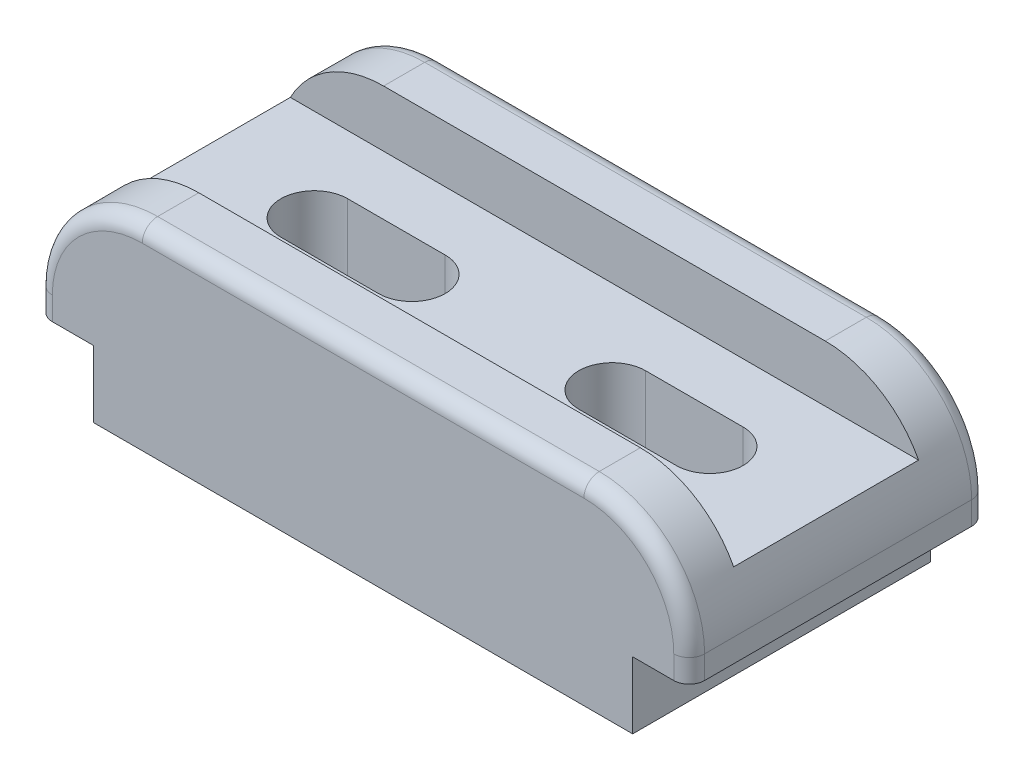
ISO-10303-21;
HEADER;
FILE_DESCRIPTION(('STEP AP214'),'2;1');
FILE_NAME('part.step','',(''),(''),'','','');
FILE_SCHEMA(('AUTOMOTIVE_DESIGN { 1 0 10303 214 1 1 1 1 }'));
ENDSEC;
DATA;
#1=APPLICATION_CONTEXT('core data for automotive mechanical design processes');
#2=APPLICATION_PROTOCOL_DEFINITION('international standard','automotive_design',2000,#1);
#3=PRODUCT_CONTEXT('',#1,'mechanical');
#4=PRODUCT('Part','Part','',(#3));
#5=PRODUCT_RELATED_PRODUCT_CATEGORY('part','',(#4));
#6=PRODUCT_DEFINITION_FORMATION('','',#4);
#7=PRODUCT_DEFINITION_CONTEXT('part definition',#1,'design');
#8=PRODUCT_DEFINITION('design','',#6,#7);
#9=PRODUCT_DEFINITION_SHAPE('','',#8);
#10=(LENGTH_UNIT() NAMED_UNIT(*) SI_UNIT(.MILLI.,.METRE.));
#11=(NAMED_UNIT(*) PLANE_ANGLE_UNIT() SI_UNIT($,.RADIAN.));
#12=(NAMED_UNIT(*) SI_UNIT($,.STERADIAN.) SOLID_ANGLE_UNIT());
#13=UNCERTAINTY_MEASURE_WITH_UNIT(LENGTH_MEASURE(1.E-05),#10,'distance_accuracy_value','');
#14=(GEOMETRIC_REPRESENTATION_CONTEXT(3) GLOBAL_UNCERTAINTY_ASSIGNED_CONTEXT((#13)) GLOBAL_UNIT_ASSIGNED_CONTEXT((#10,
#11,#12)) REPRESENTATION_CONTEXT('',''));
#15=CARTESIAN_POINT('',(0.,0.,0.));
#16=DIRECTION('',(0.,0.,1.));
#17=DIRECTION('',(1.,0.,0.));
#18=AXIS2_PLACEMENT_3D('',#15,#16,#17);
#19=CARTESIAN_POINT('',(0.,38.,0.));
#20=DIRECTION('',(0.,-1.,0.));
#21=DIRECTION('',(0.,0.,-1.));
#22=AXIS2_PLACEMENT_3D('',#19,#20,#21);
#23=PLANE('',#22);
#24=DIRECTION('',(0.,0.,-1.));
#25=VECTOR('',#24,1.);
#26=CARTESIAN_POINT('',(-42.9939033455901,38.,0.));
#27=LINE('',#26,#25);
#28=CARTESIAN_POINT('',(-42.9939033455901,38.,18.));
#29=VERTEX_POINT('',#28);
#30=CARTESIAN_POINT('',(-42.9939033455901,38.,26.));
#31=VERTEX_POINT('',#30);
#32=EDGE_CURVE('E413',#29,#31,#27,.F.);
#33=ORIENTED_EDGE('',*,*,#32,.T.);
#34=DIRECTION('',(1.,0.,0.));
#35=VECTOR('',#34,1.);
#36=CARTESIAN_POINT('',(0.,38.,26.));
#37=LINE('',#36,#35);
#38=CARTESIAN_POINT('',(42.9939033455901,38.,26.));
#39=VERTEX_POINT('',#38);
#40=EDGE_CURVE('E11',#31,#39,#37,.T.);
#41=ORIENTED_EDGE('',*,*,#40,.T.);
#42=DIRECTION('',(0.,0.,1.));
#43=VECTOR('',#42,1.);
#44=CARTESIAN_POINT('',(42.9939033455901,38.,0.));
#45=LINE('',#44,#43);
#46=CARTESIAN_POINT('',(42.9939033455901,38.,18.));
#47=VERTEX_POINT('',#46);
#48=EDGE_CURVE('E422',#39,#47,#45,.F.);
#49=ORIENTED_EDGE('',*,*,#48,.T.);
#50=DIRECTION('',(-1.,0.,0.));
#51=VECTOR('',#50,1.);
#52=CARTESIAN_POINT('',(0.,38.,18.));
#53=LINE('',#52,#51);
#54=EDGE_CURVE('E429',#47,#29,#53,.T.);
#55=ORIENTED_EDGE('',*,*,#54,.T.);
#56=EDGE_LOOP('',(#33,#41,#49,#55));
#57=FACE_BOUND('',#56,.T.);
#58=ADVANCED_FACE('F43',(#57),#23,.F.);
#59=CARTESIAN_POINT('',(42.9939033455901,17.4939033455901,-29.));
#60=DIRECTION('',(0.,0.,1.));
#61=DIRECTION('',(1.,0.,0.));
#62=AXIS2_PLACEMENT_3D('',#59,#60,#61);
#63=CYLINDRICAL_SURFACE('',#62,20.5060966544099);
#64=DIRECTION('',(0.,0.,1.));
#65=VECTOR('',#64,1.);
#66=CARTESIAN_POINT('',(63.5,17.4939033455901,29.));
#67=LINE('',#66,#65);
#68=CARTESIAN_POINT('',(63.5,17.4939033455901,-26.));
#69=VERTEX_POINT('',#68);
#70=CARTESIAN_POINT('',(63.5,17.4939033455901,26.));
#71=VERTEX_POINT('',#70);
#72=EDGE_CURVE('E417',#69,#71,#67,.T.);
#73=ORIENTED_EDGE('',*,*,#72,.F.);
#74=CARTESIAN_POINT('',(42.9939033455901,17.4939033455901,-26.));
#75=DIRECTION('',(0.,0.,1.));
#76=DIRECTION('',(1.,0.,0.));
#77=AXIS2_PLACEMENT_3D('',#74,#75,#76);
#78=CIRCLE('',#77,20.5060966544099);
#79=CARTESIAN_POINT('',(42.9939033455901,38.,-26.));
#80=VERTEX_POINT('',#79);
#81=EDGE_CURVE('E468',#69,#80,#78,.T.);
#82=ORIENTED_EDGE('',*,*,#81,.T.);
#83=CARTESIAN_POINT('',(42.9939033455901,38.,-18.));
#84=VERTEX_POINT('',#83);
#85=EDGE_CURVE('E421',#84,#80,#45,.F.);
#86=ORIENTED_EDGE('',*,*,#85,.F.);
#87=CARTESIAN_POINT('',(42.9939033455901,17.4939033455901,-18.));
#88=DIRECTION('',(0.,0.,-1.));
#89=DIRECTION('',(-1.,0.,0.));
#90=AXIS2_PLACEMENT_3D('',#87,#88,#89);
#91=CIRCLE('',#90,20.5060966544099);
#92=CARTESIAN_POINT('',(61.1634968027101,27.,-18.));
#93=VERTEX_POINT('',#92);
#94=EDGE_CURVE('E338',#93,#84,#91,.F.);
#95=ORIENTED_EDGE('',*,*,#94,.F.);
#96=DIRECTION('',(0.,0.,1.));
#97=VECTOR('',#96,1.);
#98=CARTESIAN_POINT('',(61.1634968027101,27.,-29.));
#99=LINE('',#98,#97);
#100=CARTESIAN_POINT('',(61.1634968027101,27.,18.));
#101=VERTEX_POINT('',#100);
#102=EDGE_CURVE('E347',#93,#101,#99,.T.);
#103=ORIENTED_EDGE('',*,*,#102,.T.);
#104=CARTESIAN_POINT('',(42.9939033455901,17.4939033455901,18.));
#105=DIRECTION('',(0.,0.,1.));
#106=DIRECTION('',(1.,0.,0.));
#107=AXIS2_PLACEMENT_3D('',#104,#105,#106);
#108=CIRCLE('',#107,20.5060966544099);
#109=EDGE_CURVE('E344',#47,#101,#108,.F.);
#110=ORIENTED_EDGE('',*,*,#109,.F.);
#111=ORIENTED_EDGE('',*,*,#48,.F.);
#112=CARTESIAN_POINT('',(42.9939033455901,17.4939033455901,26.));
#113=DIRECTION('',(0.,0.,-1.));
#114=DIRECTION('',(-1.,0.,0.));
#115=AXIS2_PLACEMENT_3D('',#112,#113,#114);
#116=CIRCLE('',#115,20.5060966544099);
#117=EDGE_CURVE('E465',#39,#71,#116,.T.);
#118=ORIENTED_EDGE('',*,*,#117,.T.);
#119=EDGE_LOOP('',(#73,#82,#86,#95,#103,#110,#111,#118));
#120=FACE_BOUND('',#119,.T.);
#121=ADVANCED_FACE('F568',(#120),#63,.T.);
#122=CARTESIAN_POINT('',(-42.9939033455901,17.4939033455901,29.));
#123=DIRECTION('',(0.,0.,-1.));
#124=DIRECTION('',(-1.,0.,0.));
#125=AXIS2_PLACEMENT_3D('',#122,#123,#124);
#126=CYLINDRICAL_SURFACE('',#125,20.5060966544099);
#127=CARTESIAN_POINT('',(-42.9939033455901,38.,-26.));
#128=VERTEX_POINT('',#127);
#129=CARTESIAN_POINT('',(-42.9939033455901,38.,-18.));
#130=VERTEX_POINT('',#129);
#131=EDGE_CURVE('E414',#128,#130,#27,.F.);
#132=ORIENTED_EDGE('',*,*,#131,.F.);
#133=CARTESIAN_POINT('',(-42.9939033455901,17.4939033455901,-26.));
#134=DIRECTION('',(0.,0.,1.));
#135=DIRECTION('',(1.,0.,0.));
#136=AXIS2_PLACEMENT_3D('',#133,#134,#135);
#137=CIRCLE('',#136,20.5060966544099);
#138=CARTESIAN_POINT('',(-63.5,17.4939033455901,-26.));
#139=VERTEX_POINT('',#138);
#140=EDGE_CURVE('E486',#128,#139,#137,.T.);
#141=ORIENTED_EDGE('',*,*,#140,.T.);
#142=DIRECTION('',(0.,0.,-1.));
#143=VECTOR('',#142,1.);
#144=CARTESIAN_POINT('',(-63.5,17.4939033455901,29.));
#145=LINE('',#144,#143);
#146=CARTESIAN_POINT('',(-63.5,17.4939033455901,26.));
#147=VERTEX_POINT('',#146);
#148=EDGE_CURVE('E409',#147,#139,#145,.T.);
#149=ORIENTED_EDGE('',*,*,#148,.F.);
#150=CARTESIAN_POINT('',(-42.9939033455901,17.4939033455901,26.));
#151=DIRECTION('',(0.,0.,-1.));
#152=DIRECTION('',(-1.,0.,0.));
#153=AXIS2_PLACEMENT_3D('',#150,#151,#152);
#154=CIRCLE('',#153,20.5060966544099);
#155=EDGE_CURVE('E483',#147,#31,#154,.T.);
#156=ORIENTED_EDGE('',*,*,#155,.T.);
#157=ORIENTED_EDGE('',*,*,#32,.F.);
#158=CARTESIAN_POINT('',(-42.9939033455901,17.4939033455901,18.));
#159=DIRECTION('',(0.,0.,1.));
#160=DIRECTION('',(1.,0.,0.));
#161=AXIS2_PLACEMENT_3D('',#158,#159,#160);
#162=CIRCLE('',#161,20.5060966544099);
#163=CARTESIAN_POINT('',(-61.1634968027101,27.,18.));
#164=VERTEX_POINT('',#163);
#165=EDGE_CURVE('E341',#164,#29,#162,.F.);
#166=ORIENTED_EDGE('',*,*,#165,.F.);
#167=DIRECTION('',(0.,0.,-1.));
#168=VECTOR('',#167,1.);
#169=CARTESIAN_POINT('',(-61.1634968027101,27.,29.));
#170=LINE('',#169,#168);
#171=CARTESIAN_POINT('',(-61.1634968027101,27.,-18.));
#172=VERTEX_POINT('',#171);
#173=EDGE_CURVE('E433',#164,#172,#170,.T.);
#174=ORIENTED_EDGE('',*,*,#173,.T.);
#175=CARTESIAN_POINT('',(-42.9939033455901,17.4939033455901,-18.));
#176=DIRECTION('',(0.,0.,-1.));
#177=DIRECTION('',(-1.,0.,0.));
#178=AXIS2_PLACEMENT_3D('',#175,#176,#177);
#179=CIRCLE('',#178,20.5060966544099);
#180=EDGE_CURVE('E335',#130,#172,#179,.F.);
#181=ORIENTED_EDGE('',*,*,#180,.F.);
#182=EDGE_LOOP('',(#132,#141,#149,#156,#157,#166,#174,#181));
#183=FACE_BOUND('',#182,.T.);
#184=ADVANCED_FACE('F586',(#183),#126,.T.);
#185=CARTESIAN_POINT('',(63.5,38.,29.));
#186=DIRECTION('',(-1.,0.,0.));
#187=DIRECTION('',(0.,0.,1.));
#188=AXIS2_PLACEMENT_3D('',#185,#186,#187);
#189=PLANE('',#188);
#190=DIRECTION('',(0.,0.,1.));
#191=VECTOR('',#190,1.);
#192=CARTESIAN_POINT('',(63.5,13.,0.));
#193=LINE('',#192,#191);
#194=CARTESIAN_POINT('',(63.5,13.,-26.));
#195=VERTEX_POINT('',#194);
#196=CARTESIAN_POINT('',(63.5,13.,26.));
#197=VERTEX_POINT('',#196);
#198=EDGE_CURVE('E364',#195,#197,#193,.T.);
#199=ORIENTED_EDGE('',*,*,#198,.F.);
#200=DIRECTION('',(0.,-1.,0.));
#201=VECTOR('',#200,1.);
#202=CARTESIAN_POINT('',(63.5,38.,-26.));
#203=LINE('',#202,#201);
#204=EDGE_CURVE('E462',#195,#69,#203,.F.);
#205=ORIENTED_EDGE('',*,*,#204,.T.);
#206=ORIENTED_EDGE('',*,*,#72,.T.);
#207=DIRECTION('',(0.,-1.,0.));
#208=VECTOR('',#207,1.);
#209=CARTESIAN_POINT('',(63.5,38.,26.));
#210=LINE('',#209,#208);
#211=EDGE_CURVE('E459',#71,#197,#210,.T.);
#212=ORIENTED_EDGE('',*,*,#211,.T.);
#213=EDGE_LOOP('',(#199,#205,#206,#212));
#214=FACE_BOUND('',#213,.T.);
#215=ADVANCED_FACE('F547',(#214),#189,.F.);
#216=CARTESIAN_POINT('',(-63.5,38.,-29.));
#217=DIRECTION('',(0.,0.,1.));
#218=DIRECTION('',(1.,0.,0.));
#219=AXIS2_PLACEMENT_3D('',#216,#217,#218);
#220=PLANE('',#219);
#221=CARTESIAN_POINT('',(42.9939033455901,17.4939033455901,-29.));
#222=DIRECTION('',(0.,0.,1.));
#223=DIRECTION('',(1.,0.,0.));
#224=AXIS2_PLACEMENT_3D('',#221,#222,#223);
#225=CIRCLE('',#224,17.5060966544099);
#226=CARTESIAN_POINT('',(42.9939033455901,35.,-29.));
#227=VERTEX_POINT('',#226);
#228=CARTESIAN_POINT('',(60.5,17.4939033455901,-29.));
#229=VERTEX_POINT('',#228);
#230=EDGE_CURVE('E446',#227,#229,#225,.F.);
#231=ORIENTED_EDGE('',*,*,#230,.T.);
#232=DIRECTION('',(0.,-1.,0.));
#233=VECTOR('',#232,1.);
#234=CARTESIAN_POINT('',(60.5,38.,-29.));
#235=LINE('',#234,#233);
#236=CARTESIAN_POINT('',(60.5,13.,-29.));
#237=VERTEX_POINT('',#236);
#238=EDGE_CURVE('E449',#229,#237,#235,.T.);
#239=ORIENTED_EDGE('',*,*,#238,.T.);
#240=DIRECTION('',(1.,0.,0.));
#241=VECTOR('',#240,1.);
#242=CARTESIAN_POINT('',(0.,13.,-29.));
#243=LINE('',#242,#241);
#244=CARTESIAN_POINT('',(52.5,13.,-29.));
#245=VERTEX_POINT('',#244);
#246=EDGE_CURVE('E360',#245,#237,#243,.T.);
#247=ORIENTED_EDGE('',*,*,#246,.F.);
#248=DIRECTION('',(0.,-1.,0.));
#249=VECTOR('',#248,1.);
#250=CARTESIAN_POINT('',(52.5,13.,-29.));
#251=LINE('',#250,#249);
#252=CARTESIAN_POINT('',(52.5,0.,-29.));
#253=VERTEX_POINT('',#252);
#254=EDGE_CURVE('E372',#245,#253,#251,.T.);
#255=ORIENTED_EDGE('',*,*,#254,.T.);
#256=DIRECTION('',(-1.,0.,0.));
#257=VECTOR('',#256,1.);
#258=CARTESIAN_POINT('',(-63.5,0.,-29.));
#259=LINE('',#258,#257);
#260=CARTESIAN_POINT('',(-52.5,0.,-29.));
#261=VERTEX_POINT('',#260);
#262=EDGE_CURVE('E376',#253,#261,#259,.T.);
#263=ORIENTED_EDGE('',*,*,#262,.T.);
#264=DIRECTION('',(0.,-1.,0.));
#265=VECTOR('',#264,1.);
#266=CARTESIAN_POINT('',(-52.5,13.,-29.));
#267=LINE('',#266,#265);
#268=CARTESIAN_POINT('',(-52.5,13.,-29.));
#269=VERTEX_POINT('',#268);
#270=EDGE_CURVE('E382',#269,#261,#267,.T.);
#271=ORIENTED_EDGE('',*,*,#270,.F.);
#272=DIRECTION('',(1.,0.,0.));
#273=VECTOR('',#272,1.);
#274=CARTESIAN_POINT('',(-63.5,13.,-29.));
#275=LINE('',#274,#273);
#276=CARTESIAN_POINT('',(-60.5,13.,-29.));
#277=VERTEX_POINT('',#276);
#278=EDGE_CURVE('E393',#277,#269,#275,.T.);
#279=ORIENTED_EDGE('',*,*,#278,.F.);
#280=DIRECTION('',(0.,-1.,0.));
#281=VECTOR('',#280,1.);
#282=CARTESIAN_POINT('',(-60.5,38.,-29.));
#283=LINE('',#282,#281);
#284=CARTESIAN_POINT('',(-60.5,17.4939033455901,-29.));
#285=VERTEX_POINT('',#284);
#286=EDGE_CURVE('E443',#277,#285,#283,.F.);
#287=ORIENTED_EDGE('',*,*,#286,.T.);
#288=CARTESIAN_POINT('',(-42.9939033455901,17.4939033455901,-29.));
#289=DIRECTION('',(0.,0.,1.));
#290=DIRECTION('',(1.,0.,0.));
#291=AXIS2_PLACEMENT_3D('',#288,#289,#290);
#292=CIRCLE('',#291,17.5060966544099);
#293=CARTESIAN_POINT('',(-42.9939033455901,35.,-29.));
#294=VERTEX_POINT('',#293);
#295=EDGE_CURVE('E440',#285,#294,#292,.F.);
#296=ORIENTED_EDGE('',*,*,#295,.T.);
#297=DIRECTION('',(-1.,0.,0.));
#298=VECTOR('',#297,1.);
#299=CARTESIAN_POINT('',(-63.5,35.,-29.));
#300=LINE('',#299,#298);
#301=EDGE_CURVE('E437',#294,#227,#300,.F.);
#302=ORIENTED_EDGE('',*,*,#301,.T.);
#303=EDGE_LOOP('',(#231,#239,#247,#255,#263,#271,#279,#287,#296,#302));
#304=FACE_BOUND('',#303,.T.);
#305=ADVANCED_FACE('F557',(#304),#220,.F.);
#306=CARTESIAN_POINT('',(-63.5,38.,29.));
#307=DIRECTION('',(0.,0.,-1.));
#308=DIRECTION('',(-1.,0.,0.));
#309=AXIS2_PLACEMENT_3D('',#306,#307,#308);
#310=PLANE('',#309);
#311=CARTESIAN_POINT('',(-42.9939033455901,17.4939033455901,29.));
#312=DIRECTION('',(0.,0.,-1.));
#313=DIRECTION('',(-1.,0.,0.));
#314=AXIS2_PLACEMENT_3D('',#311,#312,#313);
#315=CIRCLE('',#314,17.5060966544099);
#316=CARTESIAN_POINT('',(-42.9939033455901,35.,29.));
#317=VERTEX_POINT('',#316);
#318=CARTESIAN_POINT('',(-60.5,17.4939033455901,29.));
#319=VERTEX_POINT('',#318);
#320=EDGE_CURVE('E61',#317,#319,#315,.F.);
#321=ORIENTED_EDGE('',*,*,#320,.T.);
#322=DIRECTION('',(0.,-1.,0.));
#323=VECTOR('',#322,1.);
#324=CARTESIAN_POINT('',(-60.5,38.,29.));
#325=LINE('',#324,#323);
#326=CARTESIAN_POINT('',(-60.5,13.,29.));
#327=VERTEX_POINT('',#326);
#328=EDGE_CURVE('E499',#319,#327,#325,.T.);
#329=ORIENTED_EDGE('',*,*,#328,.T.);
#330=DIRECTION('',(1.,0.,0.));
#331=VECTOR('',#330,1.);
#332=CARTESIAN_POINT('',(-63.5,13.,29.));
#333=LINE('',#332,#331);
#334=CARTESIAN_POINT('',(-52.5,13.,29.));
#335=VERTEX_POINT('',#334);
#336=EDGE_CURVE('E389',#327,#335,#333,.T.);
#337=ORIENTED_EDGE('',*,*,#336,.T.);
#338=DIRECTION('',(0.,-1.,0.));
#339=VECTOR('',#338,1.);
#340=CARTESIAN_POINT('',(-52.5,13.,29.));
#341=LINE('',#340,#339);
#342=CARTESIAN_POINT('',(-52.5,0.,29.));
#343=VERTEX_POINT('',#342);
#344=EDGE_CURVE('E351',#335,#343,#341,.T.);
#345=ORIENTED_EDGE('',*,*,#344,.T.);
#346=DIRECTION('',(1.,0.,0.));
#347=VECTOR('',#346,1.);
#348=CARTESIAN_POINT('',(-63.5,0.,29.));
#349=LINE('',#348,#347);
#350=CARTESIAN_POINT('',(52.5,0.,29.));
#351=VERTEX_POINT('',#350);
#352=EDGE_CURVE('E405',#343,#351,#349,.T.);
#353=ORIENTED_EDGE('',*,*,#352,.T.);
#354=DIRECTION('',(0.,-1.,0.));
#355=VECTOR('',#354,1.);
#356=CARTESIAN_POINT('',(52.5,13.,29.));
#357=LINE('',#356,#355);
#358=CARTESIAN_POINT('',(52.5,13.,29.));
#359=VERTEX_POINT('',#358);
#360=EDGE_CURVE('E368',#359,#351,#357,.T.);
#361=ORIENTED_EDGE('',*,*,#360,.F.);
#362=DIRECTION('',(-1.,0.,0.));
#363=VECTOR('',#362,1.);
#364=CARTESIAN_POINT('',(0.,13.,29.));
#365=LINE('',#364,#363);
#366=CARTESIAN_POINT('',(60.5,13.,29.));
#367=VERTEX_POINT('',#366);
#368=EDGE_CURVE('E352',#367,#359,#365,.T.);
#369=ORIENTED_EDGE('',*,*,#368,.F.);
#370=DIRECTION('',(0.,-1.,0.));
#371=VECTOR('',#370,1.);
#372=CARTESIAN_POINT('',(60.5,38.,29.));
#373=LINE('',#372,#371);
#374=CARTESIAN_POINT('',(60.5,17.4939033455901,29.));
#375=VERTEX_POINT('',#374);
#376=EDGE_CURVE('E68',#367,#375,#373,.F.);
#377=ORIENTED_EDGE('',*,*,#376,.T.);
#378=CARTESIAN_POINT('',(42.9939033455901,17.4939033455901,29.));
#379=DIRECTION('',(0.,0.,-1.));
#380=DIRECTION('',(-1.,0.,0.));
#381=AXIS2_PLACEMENT_3D('',#378,#379,#380);
#382=CIRCLE('',#381,17.5060966544099);
#383=CARTESIAN_POINT('',(42.9939033455901,35.,29.));
#384=VERTEX_POINT('',#383);
#385=EDGE_CURVE('E492',#375,#384,#382,.F.);
#386=ORIENTED_EDGE('',*,*,#385,.T.);
#387=DIRECTION('',(1.,0.,0.));
#388=VECTOR('',#387,1.);
#389=CARTESIAN_POINT('',(-63.5,35.,29.));
#390=LINE('',#389,#388);
#391=EDGE_CURVE('E489',#384,#317,#390,.F.);
#392=ORIENTED_EDGE('',*,*,#391,.T.);
#393=EDGE_LOOP('',(#321,#329,#337,#345,#353,#361,#369,#377,#386,#392));
#394=FACE_BOUND('',#393,.T.);
#395=ADVANCED_FACE('F612',(#394),#310,.F.);
#396=CARTESIAN_POINT('',(0.,0.,0.));
#397=DIRECTION('',(0.,-1.,0.));
#398=DIRECTION('',(0.,0.,-1.));
#399=AXIS2_PLACEMENT_3D('',#396,#397,#398);
#400=PLANE('',#399);
#401=CARTESIAN_POINT('',(38.5,0.,0.));
#402=DIRECTION('',(0.,-1.,0.));
#403=DIRECTION('',(0.,0.,-1.));
#404=AXIS2_PLACEMENT_3D('',#401,#402,#403);
#405=CIRCLE('',#404,6.5);
#406=CARTESIAN_POINT('',(38.5,0.,-6.49999999999999));
#407=VERTEX_POINT('',#406);
#408=CARTESIAN_POINT('',(38.5,0.,6.50000000000001));
#409=VERTEX_POINT('',#408);
#410=EDGE_CURVE('E282',#407,#409,#405,.T.);
#411=ORIENTED_EDGE('',*,*,#410,.F.);
#412=DIRECTION('',(1.,0.,0.));
#413=VECTOR('',#412,1.);
#414=CARTESIAN_POINT('',(0.,0.,-6.49999999999999));
#415=LINE('',#414,#413);
#416=CARTESIAN_POINT('',(19.5,0.,-6.49999999999999));
#417=VERTEX_POINT('',#416);
#418=EDGE_CURVE('E270',#417,#407,#415,.T.);
#419=ORIENTED_EDGE('',*,*,#418,.F.);
#420=CARTESIAN_POINT('',(19.5,0.,0.));
#421=DIRECTION('',(0.,-1.,0.));
#422=DIRECTION('',(0.,0.,-1.));
#423=AXIS2_PLACEMENT_3D('',#420,#421,#422);
#424=CIRCLE('',#423,6.5);
#425=CARTESIAN_POINT('',(19.5,0.,6.50000000000001));
#426=VERTEX_POINT('',#425);
#427=EDGE_CURVE('E239',#426,#417,#424,.T.);
#428=ORIENTED_EDGE('',*,*,#427,.F.);
#429=DIRECTION('',(-1.,0.,0.));
#430=VECTOR('',#429,1.);
#431=CARTESIAN_POINT('',(0.,0.,6.50000000000001));
#432=LINE('',#431,#430);
#433=EDGE_CURVE('E279',#409,#426,#432,.T.);
#434=ORIENTED_EDGE('',*,*,#433,.F.);
#435=EDGE_LOOP('',(#411,#419,#428,#434));
#436=FACE_BOUND('',#435,.T.);
#437=CARTESIAN_POINT('',(-38.5,0.,0.));
#438=DIRECTION('',(0.,-1.,0.));
#439=DIRECTION('',(0.,0.,-1.));
#440=AXIS2_PLACEMENT_3D('',#437,#438,#439);
#441=CIRCLE('',#440,6.5);
#442=CARTESIAN_POINT('',(-38.5,0.,6.50000000000001));
#443=VERTEX_POINT('',#442);
#444=CARTESIAN_POINT('',(-38.5,0.,-6.49999999999999));
#445=VERTEX_POINT('',#444);
#446=EDGE_CURVE('E324',#443,#445,#441,.T.);
#447=ORIENTED_EDGE('',*,*,#446,.F.);
#448=DIRECTION('',(-1.,0.,0.));
#449=VECTOR('',#448,1.);
#450=CARTESIAN_POINT('',(0.,0.,6.50000000000001));
#451=LINE('',#450,#449);
#452=CARTESIAN_POINT('',(-19.5,0.,6.50000000000001));
#453=VERTEX_POINT('',#452);
#454=EDGE_CURVE('E304',#453,#443,#451,.T.);
#455=ORIENTED_EDGE('',*,*,#454,.F.);
#456=CARTESIAN_POINT('',(-19.5,0.,0.));
#457=DIRECTION('',(0.,-1.,0.));
#458=DIRECTION('',(0.,0.,-1.));
#459=AXIS2_PLACEMENT_3D('',#456,#457,#458);
#460=CIRCLE('',#459,6.5);
#461=CARTESIAN_POINT('',(-19.5,0.,-6.49999999999999));
#462=VERTEX_POINT('',#461);
#463=EDGE_CURVE('E316',#453,#462,#460,.F.);
#464=ORIENTED_EDGE('',*,*,#463,.T.);
#465=DIRECTION('',(-1.,0.,0.));
#466=VECTOR('',#465,1.);
#467=CARTESIAN_POINT('',(0.,0.,-6.49999999999999));
#468=LINE('',#467,#466);
#469=EDGE_CURVE('E320',#462,#445,#468,.T.);
#470=ORIENTED_EDGE('',*,*,#469,.T.);
#471=EDGE_LOOP('',(#447,#455,#464,#470));
#472=FACE_BOUND('',#471,.T.);
#473=DIRECTION('',(0.,0.,-1.));
#474=VECTOR('',#473,1.);
#475=CARTESIAN_POINT('',(52.5,0.,0.));
#476=LINE('',#475,#474);
#477=EDGE_CURVE('E356',#351,#253,#476,.T.);
#478=ORIENTED_EDGE('',*,*,#477,.F.);
#479=ORIENTED_EDGE('',*,*,#352,.F.);
#480=DIRECTION('',(0.,0.,-1.));
#481=VECTOR('',#480,1.);
#482=CARTESIAN_POINT('',(-52.5,0.,29.));
#483=LINE('',#482,#481);
#484=EDGE_CURVE('E371',#343,#261,#483,.T.);
#485=ORIENTED_EDGE('',*,*,#484,.T.);
#486=ORIENTED_EDGE('',*,*,#262,.F.);
#487=EDGE_LOOP('',(#478,#479,#485,#486));
#488=FACE_BOUND('',#487,.T.);
#489=ADVANCED_FACE('F610',(#436,#472,#488),#400,.T.);
#490=CARTESIAN_POINT('',(-63.5,38.,29.));
#491=DIRECTION('',(1.,0.,0.));
#492=DIRECTION('',(0.,0.,-1.));
#493=AXIS2_PLACEMENT_3D('',#490,#491,#492);
#494=PLANE('',#493);
#495=ORIENTED_EDGE('',*,*,#148,.T.);
#496=DIRECTION('',(0.,-1.,0.));
#497=VECTOR('',#496,1.);
#498=CARTESIAN_POINT('',(-63.5,38.,-26.));
#499=LINE('',#498,#497);
#500=CARTESIAN_POINT('',(-63.5,13.,-26.));
#501=VERTEX_POINT('',#500);
#502=EDGE_CURVE('E474',#139,#501,#499,.T.);
#503=ORIENTED_EDGE('',*,*,#502,.T.);
#504=DIRECTION('',(0.,0.,-1.));
#505=VECTOR('',#504,1.);
#506=CARTESIAN_POINT('',(-63.5,13.,29.));
#507=LINE('',#506,#505);
#508=CARTESIAN_POINT('',(-63.5,13.,26.));
#509=VERTEX_POINT('',#508);
#510=EDGE_CURVE('E385',#509,#501,#507,.T.);
#511=ORIENTED_EDGE('',*,*,#510,.F.);
#512=DIRECTION('',(0.,-1.,0.));
#513=VECTOR('',#512,1.);
#514=CARTESIAN_POINT('',(-63.5,38.,26.));
#515=LINE('',#514,#513);
#516=EDGE_CURVE('E471',#509,#147,#515,.F.);
#517=ORIENTED_EDGE('',*,*,#516,.T.);
#518=EDGE_LOOP('',(#495,#503,#511,#517));
#519=FACE_BOUND('',#518,.T.);
#520=ADVANCED_FACE('F591',(#519),#494,.F.);
#521=ORIENTED_EDGE('',*,*,#85,.T.);
#522=DIRECTION('',(-1.,0.,0.));
#523=VECTOR('',#522,1.);
#524=CARTESIAN_POINT('',(0.,38.,-26.));
#525=LINE('',#524,#523);
#526=EDGE_CURVE('E53',#80,#128,#525,.T.);
#527=ORIENTED_EDGE('',*,*,#526,.T.);
#528=ORIENTED_EDGE('',*,*,#131,.T.);
#529=DIRECTION('',(1.,0.,0.));
#530=VECTOR('',#529,1.);
#531=CARTESIAN_POINT('',(0.,38.,-18.));
#532=LINE('',#531,#530);
#533=EDGE_CURVE('E425',#130,#84,#532,.T.);
#534=ORIENTED_EDGE('',*,*,#533,.T.);
#535=EDGE_LOOP('',(#521,#527,#528,#534));
#536=FACE_BOUND('',#535,.T.);
#537=ADVANCED_FACE('F572',(#536),#23,.F.);
#538=CARTESIAN_POINT('',(-52.5,13.,29.));
#539=DIRECTION('',(-1.,0.,0.));
#540=DIRECTION('',(0.,0.,1.));
#541=AXIS2_PLACEMENT_3D('',#538,#539,#540);
#542=PLANE('',#541);
#543=ORIENTED_EDGE('',*,*,#484,.F.);
#544=ORIENTED_EDGE('',*,*,#344,.F.);
#545=DIRECTION('',(0.,0.,-1.));
#546=VECTOR('',#545,1.);
#547=CARTESIAN_POINT('',(-52.5,13.,29.));
#548=LINE('',#547,#546);
#549=EDGE_CURVE('E396',#335,#269,#548,.T.);
#550=ORIENTED_EDGE('',*,*,#549,.T.);
#551=ORIENTED_EDGE('',*,*,#270,.T.);
#552=EDGE_LOOP('',(#543,#544,#550,#551));
#553=FACE_BOUND('',#552,.T.);
#554=ADVANCED_FACE('F605',(#553),#542,.T.);
#555=CARTESIAN_POINT('',(0.,13.,0.));
#556=DIRECTION('',(0.,1.,0.));
#557=DIRECTION('',(0.,0.,1.));
#558=AXIS2_PLACEMENT_3D('',#555,#556,#557);
#559=PLANE('',#558);
#560=ORIENTED_EDGE('',*,*,#510,.T.);
#561=CARTESIAN_POINT('',(-60.5,13.,-26.));
#562=DIRECTION('',(0.,1.,0.));
#563=DIRECTION('',(0.,0.,1.));
#564=AXIS2_PLACEMENT_3D('',#561,#562,#563);
#565=CIRCLE('',#564,3.);
#566=EDGE_CURVE('E480',#501,#277,#565,.F.);
#567=ORIENTED_EDGE('',*,*,#566,.T.);
#568=ORIENTED_EDGE('',*,*,#278,.T.);
#569=ORIENTED_EDGE('',*,*,#549,.F.);
#570=ORIENTED_EDGE('',*,*,#336,.F.);
#571=CARTESIAN_POINT('',(-60.5,13.,26.));
#572=DIRECTION('',(0.,1.,0.));
#573=DIRECTION('',(0.,0.,1.));
#574=AXIS2_PLACEMENT_3D('',#571,#572,#573);
#575=CIRCLE('',#574,3.);
#576=EDGE_CURVE('E477',#327,#509,#575,.F.);
#577=ORIENTED_EDGE('',*,*,#576,.T.);
#578=EDGE_LOOP('',(#560,#567,#568,#569,#570,#577));
#579=FACE_BOUND('',#578,.T.);
#580=ADVANCED_FACE('F600',(#579),#559,.F.);
#581=CARTESIAN_POINT('',(52.5,13.,0.));
#582=DIRECTION('',(-1.,0.,0.));
#583=DIRECTION('',(0.,0.,1.));
#584=AXIS2_PLACEMENT_3D('',#581,#582,#583);
#585=PLANE('',#584);
#586=ORIENTED_EDGE('',*,*,#477,.T.);
#587=ORIENTED_EDGE('',*,*,#254,.F.);
#588=DIRECTION('',(0.,0.,-1.));
#589=VECTOR('',#588,1.);
#590=CARTESIAN_POINT('',(52.5,13.,0.));
#591=LINE('',#590,#589);
#592=EDGE_CURVE('E355',#359,#245,#591,.T.);
#593=ORIENTED_EDGE('',*,*,#592,.F.);
#594=ORIENTED_EDGE('',*,*,#360,.T.);
#595=EDGE_LOOP('',(#586,#587,#593,#594));
#596=FACE_BOUND('',#595,.T.);
#597=ADVANCED_FACE('F814',(#596),#585,.F.);
#598=CARTESIAN_POINT('',(0.,13.,0.));
#599=DIRECTION('',(0.,-1.,0.));
#600=DIRECTION('',(0.,0.,-1.));
#601=AXIS2_PLACEMENT_3D('',#598,#599,#600);
#602=PLANE('',#601);
#603=ORIENTED_EDGE('',*,*,#246,.T.);
#604=CARTESIAN_POINT('',(60.5,13.,-26.));
#605=DIRECTION('',(0.,-1.,0.));
#606=DIRECTION('',(0.,0.,-1.));
#607=AXIS2_PLACEMENT_3D('',#604,#605,#606);
#608=CIRCLE('',#607,3.);
#609=EDGE_CURVE('E456',#237,#195,#608,.T.);
#610=ORIENTED_EDGE('',*,*,#609,.T.);
#611=ORIENTED_EDGE('',*,*,#198,.T.);
#612=CARTESIAN_POINT('',(60.5,13.,26.));
#613=DIRECTION('',(0.,-1.,0.));
#614=DIRECTION('',(0.,0.,-1.));
#615=AXIS2_PLACEMENT_3D('',#612,#613,#614);
#616=CIRCLE('',#615,3.);
#617=EDGE_CURVE('E453',#197,#367,#616,.T.);
#618=ORIENTED_EDGE('',*,*,#617,.T.);
#619=ORIENTED_EDGE('',*,*,#368,.T.);
#620=ORIENTED_EDGE('',*,*,#592,.T.);
#621=EDGE_LOOP('',(#603,#610,#611,#618,#619,#620));
#622=FACE_BOUND('',#621,.T.);
#623=ADVANCED_FACE('F551',(#622),#602,.T.);
#624=CARTESIAN_POINT('',(-63.5,27.,18.));
#625=DIRECTION('',(0.,0.,1.));
#626=DIRECTION('',(1.,0.,0.));
#627=AXIS2_PLACEMENT_3D('',#624,#625,#626);
#628=PLANE('',#627);
#629=ORIENTED_EDGE('',*,*,#109,.T.);
#630=DIRECTION('',(-1.,0.,0.));
#631=VECTOR('',#630,1.);
#632=CARTESIAN_POINT('',(63.5,27.,18.));
#633=LINE('',#632,#631);
#634=EDGE_CURVE('E327',#101,#164,#633,.T.);
#635=ORIENTED_EDGE('',*,*,#634,.T.);
#636=ORIENTED_EDGE('',*,*,#165,.T.);
#637=ORIENTED_EDGE('',*,*,#54,.F.);
#638=EDGE_LOOP('',(#629,#635,#636,#637));
#639=FACE_BOUND('',#638,.T.);
#640=ADVANCED_FACE('F798',(#639),#628,.F.);
#641=CARTESIAN_POINT('',(63.5,27.,-18.));
#642=DIRECTION('',(0.,0.,-1.));
#643=DIRECTION('',(-1.,0.,0.));
#644=AXIS2_PLACEMENT_3D('',#641,#642,#643);
#645=PLANE('',#644);
#646=ORIENTED_EDGE('',*,*,#94,.T.);
#647=ORIENTED_EDGE('',*,*,#533,.F.);
#648=ORIENTED_EDGE('',*,*,#180,.T.);
#649=DIRECTION('',(-1.,0.,0.));
#650=VECTOR('',#649,1.);
#651=CARTESIAN_POINT('',(-0.380283645564305,27.,-18.));
#652=LINE('',#651,#650);
#653=EDGE_CURVE('E331',#93,#172,#652,.T.);
#654=ORIENTED_EDGE('',*,*,#653,.F.);
#655=EDGE_LOOP('',(#646,#647,#648,#654));
#656=FACE_BOUND('',#655,.T.);
#657=ADVANCED_FACE('F791',(#656),#645,.F.);
#658=CARTESIAN_POINT('',(0.,27.,0.));
#659=DIRECTION('',(0.,1.,0.));
#660=DIRECTION('',(0.,0.,1.));
#661=AXIS2_PLACEMENT_3D('',#658,#659,#660);
#662=PLANE('',#661);
#663=CARTESIAN_POINT('',(38.5,27.,0.));
#664=DIRECTION('',(0.,1.,0.));
#665=DIRECTION('',(0.,0.,-1.));
#666=AXIS2_PLACEMENT_3D('',#663,#664,#665);
#667=CIRCLE('',#666,6.5);
#668=CARTESIAN_POINT('',(38.5,27.,6.50000000000001));
#669=VERTEX_POINT('',#668);
#670=CARTESIAN_POINT('',(38.5,27.,-6.49999999999999));
#671=VERTEX_POINT('',#670);
#672=EDGE_CURVE('E254',#669,#671,#667,.T.);
#673=ORIENTED_EDGE('',*,*,#672,.F.);
#674=DIRECTION('',(1.,0.,0.));
#675=VECTOR('',#674,1.);
#676=CARTESIAN_POINT('',(38.5,27.,6.50000000000001));
#677=LINE('',#676,#675);
#678=CARTESIAN_POINT('',(19.5,27.,6.50000000000001));
#679=VERTEX_POINT('',#678);
#680=EDGE_CURVE('E259',#679,#669,#677,.T.);
#681=ORIENTED_EDGE('',*,*,#680,.F.);
#682=CARTESIAN_POINT('',(19.5,27.,0.));
#683=DIRECTION('',(0.,1.,0.));
#684=DIRECTION('',(0.,0.,1.));
#685=AXIS2_PLACEMENT_3D('',#682,#683,#684);
#686=CIRCLE('',#685,6.5);
#687=CARTESIAN_POINT('',(19.5,27.,-6.49999999999999));
#688=VERTEX_POINT('',#687);
#689=EDGE_CURVE('E236',#688,#679,#686,.T.);
#690=ORIENTED_EDGE('',*,*,#689,.F.);
#691=DIRECTION('',(-1.,0.,0.));
#692=VECTOR('',#691,1.);
#693=CARTESIAN_POINT('',(38.5,27.,-6.49999999999999));
#694=LINE('',#693,#692);
#695=EDGE_CURVE('E248',#671,#688,#694,.T.);
#696=ORIENTED_EDGE('',*,*,#695,.F.);
#697=EDGE_LOOP('',(#673,#681,#690,#696));
#698=FACE_BOUND('',#697,.T.);
#699=CARTESIAN_POINT('',(-38.5,27.,0.));
#700=DIRECTION('',(0.,1.,0.));
#701=DIRECTION('',(0.,0.,1.));
#702=AXIS2_PLACEMENT_3D('',#699,#700,#701);
#703=CIRCLE('',#702,6.5);
#704=CARTESIAN_POINT('',(-38.5,27.,-6.49999999999999));
#705=VERTEX_POINT('',#704);
#706=CARTESIAN_POINT('',(-38.5,27.,6.50000000000001));
#707=VERTEX_POINT('',#706);
#708=EDGE_CURVE('E285',#705,#707,#703,.T.);
#709=ORIENTED_EDGE('',*,*,#708,.F.);
#710=DIRECTION('',(1.,0.,0.));
#711=VECTOR('',#710,1.);
#712=CARTESIAN_POINT('',(-38.5,27.,-6.49999999999999));
#713=LINE('',#712,#711);
#714=CARTESIAN_POINT('',(-19.5,27.,-6.49999999999999));
#715=VERTEX_POINT('',#714);
#716=EDGE_CURVE('E296',#705,#715,#713,.T.);
#717=ORIENTED_EDGE('',*,*,#716,.T.);
#718=CARTESIAN_POINT('',(-19.5,27.,0.));
#719=DIRECTION('',(0.,-1.,0.));
#720=DIRECTION('',(0.,0.,-1.));
#721=AXIS2_PLACEMENT_3D('',#718,#719,#720);
#722=CIRCLE('',#721,6.5);
#723=CARTESIAN_POINT('',(-19.5,27.,6.50000000000001));
#724=VERTEX_POINT('',#723);
#725=EDGE_CURVE('E292',#715,#724,#722,.T.);
#726=ORIENTED_EDGE('',*,*,#725,.T.);
#727=DIRECTION('',(1.,0.,0.));
#728=VECTOR('',#727,1.);
#729=CARTESIAN_POINT('',(-38.5,27.,6.50000000000001));
#730=LINE('',#729,#728);
#731=EDGE_CURVE('E288',#707,#724,#730,.T.);
#732=ORIENTED_EDGE('',*,*,#731,.F.);
#733=EDGE_LOOP('',(#709,#717,#726,#732));
#734=FACE_BOUND('',#733,.T.);
#735=ORIENTED_EDGE('',*,*,#653,.T.);
#736=ORIENTED_EDGE('',*,*,#173,.F.);
#737=ORIENTED_EDGE('',*,*,#634,.F.);
#738=ORIENTED_EDGE('',*,*,#102,.F.);
#739=EDGE_LOOP('',(#735,#736,#737,#738));
#740=FACE_BOUND('',#739,.T.);
#741=ADVANCED_FACE('F256',(#698,#734,#740),#662,.T.);
#742=CARTESIAN_POINT('',(-38.5,-23.,0.));
#743=DIRECTION('',(0.,1.,0.));
#744=DIRECTION('',(0.,0.,1.));
#745=AXIS2_PLACEMENT_3D('',#742,#743,#744);
#746=CYLINDRICAL_SURFACE('',#745,6.5);
#747=ORIENTED_EDGE('',*,*,#446,.T.);
#748=DIRECTION('',(0.,1.,0.));
#749=VECTOR('',#748,1.);
#750=CARTESIAN_POINT('',(-38.5,-23.,-6.49999999999999));
#751=LINE('',#750,#749);
#752=EDGE_CURVE('E301',#445,#705,#751,.T.);
#753=ORIENTED_EDGE('',*,*,#752,.T.);
#754=ORIENTED_EDGE('',*,*,#708,.T.);
#755=DIRECTION('',(0.,1.,0.));
#756=VECTOR('',#755,1.);
#757=CARTESIAN_POINT('',(-38.5,-23.,6.50000000000001));
#758=LINE('',#757,#756);
#759=EDGE_CURVE('E300',#443,#707,#758,.T.);
#760=ORIENTED_EDGE('',*,*,#759,.F.);
#761=EDGE_LOOP('',(#747,#753,#754,#760));
#762=FACE_BOUND('',#761,.T.);
#763=ADVANCED_FACE('F776',(#762),#746,.F.);
#764=CARTESIAN_POINT('',(-38.5,-23.,-6.49999999999999));
#765=DIRECTION('',(0.,0.,1.));
#766=DIRECTION('',(1.,0.,0.));
#767=AXIS2_PLACEMENT_3D('',#764,#765,#766);
#768=PLANE('',#767);
#769=DIRECTION('',(0.,1.,0.));
#770=VECTOR('',#769,1.);
#771=CARTESIAN_POINT('',(-19.5,-23.,-6.49999999999999));
#772=LINE('',#771,#770);
#773=EDGE_CURVE('E305',#462,#715,#772,.T.);
#774=ORIENTED_EDGE('',*,*,#773,.T.);
#775=ORIENTED_EDGE('',*,*,#716,.F.);
#776=ORIENTED_EDGE('',*,*,#752,.F.);
#777=ORIENTED_EDGE('',*,*,#469,.F.);
#778=EDGE_LOOP('',(#774,#775,#776,#777));
#779=FACE_BOUND('',#778,.T.);
#780=ADVANCED_FACE('F768',(#779),#768,.T.);
#781=CARTESIAN_POINT('',(-19.5,-23.,0.));
#782=DIRECTION('',(0.,1.,0.));
#783=DIRECTION('',(0.,0.,1.));
#784=AXIS2_PLACEMENT_3D('',#781,#782,#783);
#785=CYLINDRICAL_SURFACE('',#784,6.5);
#786=DIRECTION('',(0.,1.,0.));
#787=VECTOR('',#786,1.);
#788=CARTESIAN_POINT('',(-19.5,-23.,6.50000000000001));
#789=LINE('',#788,#787);
#790=EDGE_CURVE('E308',#453,#724,#789,.T.);
#791=ORIENTED_EDGE('',*,*,#790,.T.);
#792=ORIENTED_EDGE('',*,*,#725,.F.);
#793=ORIENTED_EDGE('',*,*,#773,.F.);
#794=ORIENTED_EDGE('',*,*,#463,.F.);
#795=EDGE_LOOP('',(#791,#792,#793,#794));
#796=FACE_BOUND('',#795,.T.);
#797=ADVANCED_FACE('F760',(#796),#785,.F.);
#798=CARTESIAN_POINT('',(-38.5,-23.,6.50000000000001));
#799=DIRECTION('',(0.,0.,1.));
#800=DIRECTION('',(1.,0.,0.));
#801=AXIS2_PLACEMENT_3D('',#798,#799,#800);
#802=PLANE('',#801);
#803=ORIENTED_EDGE('',*,*,#454,.T.);
#804=ORIENTED_EDGE('',*,*,#759,.T.);
#805=ORIENTED_EDGE('',*,*,#731,.T.);
#806=ORIENTED_EDGE('',*,*,#790,.F.);
#807=EDGE_LOOP('',(#803,#804,#805,#806));
#808=FACE_BOUND('',#807,.T.);
#809=ADVANCED_FACE('F752',(#808),#802,.F.);
#810=CARTESIAN_POINT('',(38.5,-23.,0.));
#811=DIRECTION('',(0.,1.,0.));
#812=DIRECTION('',(0.,0.,1.));
#813=AXIS2_PLACEMENT_3D('',#810,#811,#812);
#814=CYLINDRICAL_SURFACE('',#813,6.5);
#815=ORIENTED_EDGE('',*,*,#410,.T.);
#816=DIRECTION('',(0.,1.,0.));
#817=VECTOR('',#816,1.);
#818=CARTESIAN_POINT('',(38.5,-23.,6.50000000000001));
#819=LINE('',#818,#817);
#820=EDGE_CURVE('E267',#409,#669,#819,.T.);
#821=ORIENTED_EDGE('',*,*,#820,.T.);
#822=ORIENTED_EDGE('',*,*,#672,.T.);
#823=DIRECTION('',(0.,1.,0.));
#824=VECTOR('',#823,1.);
#825=CARTESIAN_POINT('',(38.5,-23.,-6.49999999999999));
#826=LINE('',#825,#824);
#827=EDGE_CURVE('E244',#407,#671,#826,.T.);
#828=ORIENTED_EDGE('',*,*,#827,.F.);
#829=EDGE_LOOP('',(#815,#821,#822,#828));
#830=FACE_BOUND('',#829,.T.);
#831=ADVANCED_FACE('F744',(#830),#814,.F.);
#832=CARTESIAN_POINT('',(38.5,-23.,6.50000000000001));
#833=DIRECTION('',(0.,0.,1.));
#834=DIRECTION('',(1.,0.,0.));
#835=AXIS2_PLACEMENT_3D('',#832,#833,#834);
#836=PLANE('',#835);
#837=ORIENTED_EDGE('',*,*,#433,.T.);
#838=DIRECTION('',(0.,1.,0.));
#839=VECTOR('',#838,1.);
#840=CARTESIAN_POINT('',(19.5,-23.,6.50000000000001));
#841=LINE('',#840,#839);
#842=EDGE_CURVE('E243',#426,#679,#841,.T.);
#843=ORIENTED_EDGE('',*,*,#842,.T.);
#844=ORIENTED_EDGE('',*,*,#680,.T.);
#845=ORIENTED_EDGE('',*,*,#820,.F.);
#846=EDGE_LOOP('',(#837,#843,#844,#845));
#847=FACE_BOUND('',#846,.T.);
#848=ADVANCED_FACE('F737',(#847),#836,.F.);
#849=CARTESIAN_POINT('',(19.5,-23.,0.));
#850=DIRECTION('',(0.,1.,0.));
#851=DIRECTION('',(0.,0.,1.));
#852=AXIS2_PLACEMENT_3D('',#849,#850,#851);
#853=CYLINDRICAL_SURFACE('',#852,6.5);
#854=ORIENTED_EDGE('',*,*,#427,.T.);
#855=DIRECTION('',(0.,1.,0.));
#856=VECTOR('',#855,1.);
#857=CARTESIAN_POINT('',(19.5,-23.,-6.49999999999999));
#858=LINE('',#857,#856);
#859=EDGE_CURVE('E231',#417,#688,#858,.T.);
#860=ORIENTED_EDGE('',*,*,#859,.T.);
#861=ORIENTED_EDGE('',*,*,#689,.T.);
#862=ORIENTED_EDGE('',*,*,#842,.F.);
#863=EDGE_LOOP('',(#854,#860,#861,#862));
#864=FACE_BOUND('',#863,.T.);
#865=ADVANCED_FACE('F233',(#864),#853,.F.);
#866=CARTESIAN_POINT('',(38.5,-23.,-6.49999999999999));
#867=DIRECTION('',(0.,0.,-1.));
#868=DIRECTION('',(-1.,0.,0.));
#869=AXIS2_PLACEMENT_3D('',#866,#867,#868);
#870=PLANE('',#869);
#871=ORIENTED_EDGE('',*,*,#418,.T.);
#872=ORIENTED_EDGE('',*,*,#827,.T.);
#873=ORIENTED_EDGE('',*,*,#695,.T.);
#874=ORIENTED_EDGE('',*,*,#859,.F.);
#875=EDGE_LOOP('',(#871,#872,#873,#874));
#876=FACE_BOUND('',#875,.T.);
#877=ADVANCED_FACE('F249',(#876),#870,.F.);
#878=CARTESIAN_POINT('',(-60.5,38.,-26.));
#879=DIRECTION('',(0.,-1.,0.));
#880=DIRECTION('',(0.,0.,-1.));
#881=AXIS2_PLACEMENT_3D('',#878,#879,#880);
#882=CYLINDRICAL_SURFACE('',#881,3.);
#883=ORIENTED_EDGE('',*,*,#566,.F.);
#884=ORIENTED_EDGE('',*,*,#502,.F.);
#885=CARTESIAN_POINT('',(-60.5,17.4939033455901,-26.));
#886=DIRECTION('',(0.,1.,0.));
#887=DIRECTION('',(0.,0.,1.));
#888=AXIS2_PLACEMENT_3D('',#885,#886,#887);
#889=CIRCLE('',#888,3.);
#890=EDGE_CURVE('E516',#285,#139,#889,.T.);
#891=ORIENTED_EDGE('',*,*,#890,.F.);
#892=ORIENTED_EDGE('',*,*,#286,.F.);
#893=EDGE_LOOP('',(#883,#884,#891,#892));
#894=FACE_BOUND('',#893,.T.);
#895=ADVANCED_FACE('F596',(#894),#882,.T.);
#896=CARTESIAN_POINT('',(-42.9939033455901,17.4939033455901,-26.));
#897=DIRECTION('',(0.,0.,1.));
#898=DIRECTION('',(1.,0.,0.));
#899=AXIS2_PLACEMENT_3D('',#896,#897,#898);
#900=TOROIDAL_SURFACE('',#899,17.5060966544099,3.);
#901=ORIENTED_EDGE('',*,*,#890,.T.);
#902=ORIENTED_EDGE('',*,*,#140,.F.);
#903=CARTESIAN_POINT('',(-42.9939033455901,35.,-26.));
#904=DIRECTION('',(1.,0.,0.));
#905=DIRECTION('',(0.,0.,-1.));
#906=AXIS2_PLACEMENT_3D('',#903,#904,#905);
#907=CIRCLE('',#906,3.);
#908=EDGE_CURVE('E512',#294,#128,#907,.T.);
#909=ORIENTED_EDGE('',*,*,#908,.F.);
#910=ORIENTED_EDGE('',*,*,#295,.F.);
#911=EDGE_LOOP('',(#901,#902,#909,#910));
#912=FACE_BOUND('',#911,.T.);
#913=ADVANCED_FACE('F582',(#912),#900,.T.);
#914=CARTESIAN_POINT('',(0.,35.,-26.));
#915=DIRECTION('',(-1.,0.,0.));
#916=DIRECTION('',(0.,0.,1.));
#917=AXIS2_PLACEMENT_3D('',#914,#915,#916);
#918=CYLINDRICAL_SURFACE('',#917,3.);
#919=ORIENTED_EDGE('',*,*,#908,.T.);
#920=ORIENTED_EDGE('',*,*,#526,.F.);
#921=CARTESIAN_POINT('',(42.9939033455901,35.,-26.));
#922=DIRECTION('',(1.,0.,0.));
#923=DIRECTION('',(0.,0.,-1.));
#924=AXIS2_PLACEMENT_3D('',#921,#922,#923);
#925=CIRCLE('',#924,3.);
#926=EDGE_CURVE('E508',#227,#80,#925,.T.);
#927=ORIENTED_EDGE('',*,*,#926,.F.);
#928=ORIENTED_EDGE('',*,*,#301,.F.);
#929=EDGE_LOOP('',(#919,#920,#927,#928));
#930=FACE_BOUND('',#929,.T.);
#931=ADVANCED_FACE('F577',(#930),#918,.T.);
#932=CARTESIAN_POINT('',(42.9939033455901,17.4939033455901,-26.));
#933=DIRECTION('',(0.,0.,1.));
#934=DIRECTION('',(1.,0.,0.));
#935=AXIS2_PLACEMENT_3D('',#932,#933,#934);
#936=TOROIDAL_SURFACE('',#935,17.5060966544099,3.);
#937=ORIENTED_EDGE('',*,*,#926,.T.);
#938=ORIENTED_EDGE('',*,*,#81,.F.);
#939=CARTESIAN_POINT('',(60.5,17.4939033455901,-26.));
#940=DIRECTION('',(0.,-1.,0.));
#941=DIRECTION('',(0.,0.,-1.));
#942=AXIS2_PLACEMENT_3D('',#939,#940,#941);
#943=CIRCLE('',#942,3.);
#944=EDGE_CURVE('E504',#229,#69,#943,.T.);
#945=ORIENTED_EDGE('',*,*,#944,.F.);
#946=ORIENTED_EDGE('',*,*,#230,.F.);
#947=EDGE_LOOP('',(#937,#938,#945,#946));
#948=FACE_BOUND('',#947,.T.);
#949=ADVANCED_FACE('F564',(#948),#936,.T.);
#950=CARTESIAN_POINT('',(60.5,38.,-26.));
#951=DIRECTION('',(0.,-1.,0.));
#952=DIRECTION('',(0.,0.,-1.));
#953=AXIS2_PLACEMENT_3D('',#950,#951,#952);
#954=CYLINDRICAL_SURFACE('',#953,3.);
#955=ORIENTED_EDGE('',*,*,#944,.T.);
#956=ORIENTED_EDGE('',*,*,#204,.F.);
#957=ORIENTED_EDGE('',*,*,#609,.F.);
#958=ORIENTED_EDGE('',*,*,#238,.F.);
#959=EDGE_LOOP('',(#955,#956,#957,#958));
#960=FACE_BOUND('',#959,.T.);
#961=ADVANCED_FACE('F555',(#960),#954,.T.);
#962=CARTESIAN_POINT('',(60.5,38.,26.));
#963=DIRECTION('',(0.,-1.,0.));
#964=DIRECTION('',(0.,0.,-1.));
#965=AXIS2_PLACEMENT_3D('',#962,#963,#964);
#966=CYLINDRICAL_SURFACE('',#965,3.);
#967=ORIENTED_EDGE('',*,*,#617,.F.);
#968=ORIENTED_EDGE('',*,*,#211,.F.);
#969=CARTESIAN_POINT('',(60.5,17.4939033455901,26.));
#970=DIRECTION('',(0.,1.,0.));
#971=DIRECTION('',(0.,0.,1.));
#972=AXIS2_PLACEMENT_3D('',#969,#970,#971);
#973=CIRCLE('',#972,3.);
#974=EDGE_CURVE('E47',#375,#71,#973,.T.);
#975=ORIENTED_EDGE('',*,*,#974,.F.);
#976=ORIENTED_EDGE('',*,*,#376,.F.);
#977=EDGE_LOOP('',(#967,#968,#975,#976));
#978=FACE_BOUND('',#977,.T.);
#979=ADVANCED_FACE('F45',(#978),#966,.T.);
#980=CARTESIAN_POINT('',(42.9939033455901,17.4939033455901,26.));
#981=DIRECTION('',(0.,0.,-1.));
#982=DIRECTION('',(-1.,0.,0.));
#983=AXIS2_PLACEMENT_3D('',#980,#981,#982);
#984=TOROIDAL_SURFACE('',#983,17.5060966544099,3.);
#985=ORIENTED_EDGE('',*,*,#974,.T.);
#986=ORIENTED_EDGE('',*,*,#117,.F.);
#987=CARTESIAN_POINT('',(42.9939033455901,35.,26.));
#988=DIRECTION('',(-1.,0.,0.));
#989=DIRECTION('',(0.,0.,1.));
#990=AXIS2_PLACEMENT_3D('',#987,#988,#989);
#991=CIRCLE('',#990,3.);
#992=EDGE_CURVE('E527',#384,#39,#991,.T.);
#993=ORIENTED_EDGE('',*,*,#992,.F.);
#994=ORIENTED_EDGE('',*,*,#385,.F.);
#995=EDGE_LOOP('',(#985,#986,#993,#994));
#996=FACE_BOUND('',#995,.T.);
#997=ADVANCED_FACE('F541',(#996),#984,.T.);
#998=CARTESIAN_POINT('',(0.,35.,26.));
#999=DIRECTION('',(1.,0.,0.));
#1000=DIRECTION('',(0.,0.,-1.));
#1001=AXIS2_PLACEMENT_3D('',#998,#999,#1000);
#1002=CYLINDRICAL_SURFACE('',#1001,3.);
#1003=ORIENTED_EDGE('',*,*,#992,.T.);
#1004=ORIENTED_EDGE('',*,*,#40,.F.);
#1005=CARTESIAN_POINT('',(-42.9939033455901,35.,26.));
#1006=DIRECTION('',(-1.,0.,0.));
#1007=DIRECTION('',(0.,0.,1.));
#1008=AXIS2_PLACEMENT_3D('',#1005,#1006,#1007);
#1009=CIRCLE('',#1008,3.);
#1010=EDGE_CURVE('E524',#317,#31,#1009,.T.);
#1011=ORIENTED_EDGE('',*,*,#1010,.F.);
#1012=ORIENTED_EDGE('',*,*,#391,.F.);
#1013=EDGE_LOOP('',(#1003,#1004,#1011,#1012));
#1014=FACE_BOUND('',#1013,.T.);
#1015=ADVANCED_FACE('F627',(#1014),#1002,.T.);
#1016=CARTESIAN_POINT('',(-42.9939033455901,17.4939033455901,26.));
#1017=DIRECTION('',(0.,0.,-1.));
#1018=DIRECTION('',(-1.,0.,0.));
#1019=AXIS2_PLACEMENT_3D('',#1016,#1017,#1018);
#1020=TOROIDAL_SURFACE('',#1019,17.5060966544099,3.);
#1021=ORIENTED_EDGE('',*,*,#1010,.T.);
#1022=ORIENTED_EDGE('',*,*,#155,.F.);
#1023=CARTESIAN_POINT('',(-60.5,17.4939033455901,26.));
#1024=DIRECTION('',(0.,-1.,0.));
#1025=DIRECTION('',(0.,0.,-1.));
#1026=AXIS2_PLACEMENT_3D('',#1023,#1024,#1025);
#1027=CIRCLE('',#1026,3.);
#1028=EDGE_CURVE('E520',#319,#147,#1027,.T.);
#1029=ORIENTED_EDGE('',*,*,#1028,.F.);
#1030=ORIENTED_EDGE('',*,*,#320,.F.);
#1031=EDGE_LOOP('',(#1021,#1022,#1029,#1030));
#1032=FACE_BOUND('',#1031,.T.);
#1033=ADVANCED_FACE('F618',(#1032),#1020,.T.);
#1034=CARTESIAN_POINT('',(-60.5,38.,26.));
#1035=DIRECTION('',(0.,-1.,0.));
#1036=DIRECTION('',(0.,0.,-1.));
#1037=AXIS2_PLACEMENT_3D('',#1034,#1035,#1036);
#1038=CYLINDRICAL_SURFACE('',#1037,3.);
#1039=ORIENTED_EDGE('',*,*,#1028,.T.);
#1040=ORIENTED_EDGE('',*,*,#516,.F.);
#1041=ORIENTED_EDGE('',*,*,#576,.F.);
#1042=ORIENTED_EDGE('',*,*,#328,.F.);
#1043=EDGE_LOOP('',(#1039,#1040,#1041,#1042));
#1044=FACE_BOUND('',#1043,.T.);
#1045=ADVANCED_FACE('F616',(#1044),#1038,.T.);
#1046=CLOSED_SHELL('',(#58,#121,#184,#215,#305,#395,#489,#520,#537,#554,#580,#597,#623,#640,
#657,#741,#763,#780,#797,#809,#831,#848,#865,#877,#895,#913,#931,#949,#961,#979,#997,#1015,
#1033,#1045));
#1047=MANIFOLD_SOLID_BREP('B2',#1046);
#1048=ADVANCED_BREP_SHAPE_REPRESENTATION('',(#18,#1047),#14);
#1049=SHAPE_DEFINITION_REPRESENTATION(#9,#1048);
ENDSEC;
END-ISO-10303-21;
